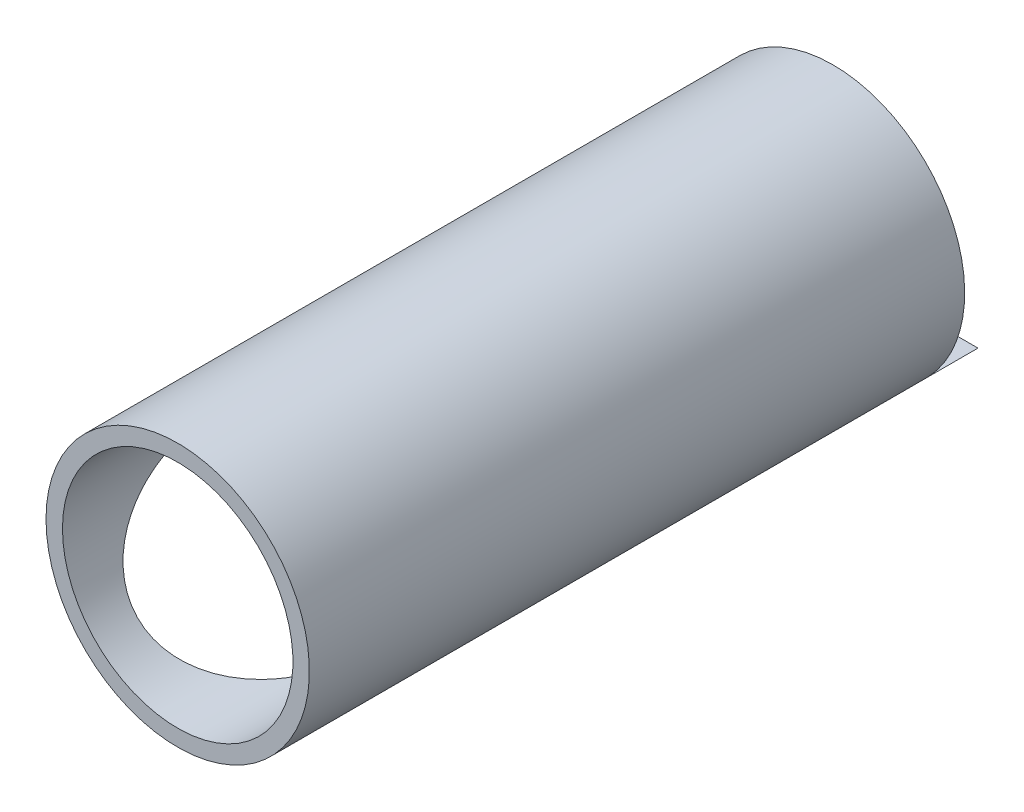
ISO-10303-21;
HEADER;
FILE_DESCRIPTION(('STEP AP214'),'2;1');
FILE_NAME('part.step','',(''),(''),'','','');
FILE_SCHEMA(('AUTOMOTIVE_DESIGN { 1 0 10303 214 1 1 1 1 }'));
ENDSEC;
DATA;
#1=APPLICATION_CONTEXT('core data for automotive mechanical design processes');
#2=APPLICATION_PROTOCOL_DEFINITION('international standard','automotive_design',2000,#1);
#3=PRODUCT_CONTEXT('',#1,'mechanical');
#4=PRODUCT('Part','Part','',(#3));
#5=PRODUCT_RELATED_PRODUCT_CATEGORY('part','',(#4));
#6=PRODUCT_DEFINITION_FORMATION('','',#4);
#7=PRODUCT_DEFINITION_CONTEXT('part definition',#1,'design');
#8=PRODUCT_DEFINITION('design','',#6,#7);
#9=PRODUCT_DEFINITION_SHAPE('','',#8);
#10=(LENGTH_UNIT() NAMED_UNIT(*) SI_UNIT(.MILLI.,.METRE.));
#11=(NAMED_UNIT(*) PLANE_ANGLE_UNIT() SI_UNIT($,.RADIAN.));
#12=(NAMED_UNIT(*) SI_UNIT($,.STERADIAN.) SOLID_ANGLE_UNIT());
#13=UNCERTAINTY_MEASURE_WITH_UNIT(LENGTH_MEASURE(1.E-05),#10,'distance_accuracy_value','');
#14=(GEOMETRIC_REPRESENTATION_CONTEXT(3) GLOBAL_UNCERTAINTY_ASSIGNED_CONTEXT((#13)) GLOBAL_UNIT_ASSIGNED_CONTEXT((#10,
#11,#12)) REPRESENTATION_CONTEXT('',''));
#15=CARTESIAN_POINT('',(0.,0.,0.));
#16=DIRECTION('',(0.,0.,1.));
#17=DIRECTION('',(1.,0.,0.));
#18=AXIS2_PLACEMENT_3D('',#15,#16,#17);
#19=CARTESIAN_POINT('',(0.,0.,914.4));
#20=DIRECTION('',(0.,0.,-1.));
#21=DIRECTION('',(-1.,0.,0.));
#22=AXIS2_PLACEMENT_3D('',#19,#20,#21);
#23=CYLINDRICAL_SURFACE('',#22,25.4);
#24=CARTESIAN_POINT('',(-25.4,0.,115.19761790129));
#25=CARTESIAN_POINT('',(-25.399996884516,-0.271241277179025,115.740107734813));
#26=CARTESIAN_POINT('',(-25.3956372703446,-0.570319205410117,116.268795318202));
#27=CARTESIAN_POINT('',(-25.3730067966504,-1.21427593289881,117.297529798691));
#28=CARTESIAN_POINT('',(-25.3547223737562,-1.55919911687239,117.797548259892));
#29=CARTESIAN_POINT('',(-25.2993697103061,-2.28826210371164,118.770410162585));
#30=CARTESIAN_POINT('',(-25.2622187567671,-2.67256859427139,119.243123644354));
#31=CARTESIAN_POINT('',(-25.1647450990912,-3.47245511366578,120.158445068275));
#32=CARTESIAN_POINT('',(-25.1044292933946,-3.88802580249541,120.601061926988));
#33=CARTESIAN_POINT('',(-24.956913941438,-4.7434234668756,121.453811569184));
#34=CARTESIAN_POINT('',(-24.8698241527874,-5.18314549994396,121.864068536087));
#35=CARTESIAN_POINT('',(-24.6649935561155,-6.08370120049547,122.652636231781));
#36=CARTESIAN_POINT('',(-24.5472493952855,-6.54453717276067,123.030943460085));
#37=CARTESIAN_POINT('',(-24.2779838816026,-7.48174520991067,123.752546174178));
#38=CARTESIAN_POINT('',(-24.1265460094466,-7.95807643493598,124.095925187073));
#39=CARTESIAN_POINT('',(-23.8717509700124,-8.68129558234989,124.583152262138));
#40=CARTESIAN_POINT('',(-23.7822196818804,-8.92380619331525,124.740911632665));
#41=CARTESIAN_POINT('',(-23.5935700495922,-9.41125713681797,125.046817140195));
#42=CARTESIAN_POINT('',(-23.4944492762025,-9.656198070834,125.194960825362));
#43=CARTESIAN_POINT('',(-23.2247367736403,-10.2933018383133,125.565823763737));
#44=CARTESIAN_POINT('',(-23.0465583327941,-10.6868211506589,125.780803863008));
#45=CARTESIAN_POINT('',(-22.6642694391263,-11.47531377387,126.183069680225));
#46=CARTESIAN_POINT('',(-22.4601643886902,-11.8702867652277,126.370361150171));
#47=CARTESIAN_POINT('',(-22.0254946586909,-12.65859700988,126.715177849977));
#48=CARTESIAN_POINT('',(-21.7949363203582,-13.0519346318665,126.872710189663));
#49=CARTESIAN_POINT('',(-21.3073191953774,-13.8336668949029,127.155982188105));
#50=CARTESIAN_POINT('',(-21.0502600567856,-14.2220614702298,127.281721424556));
#51=CARTESIAN_POINT('',(-20.5085633518285,-14.9927328173247,127.500203111253));
#52=CARTESIAN_POINT('',(-20.2237605972016,-15.3749548841771,127.592730349098));
#53=CARTESIAN_POINT('',(-19.6293574322414,-16.1269336835204,127.742092104226));
#54=CARTESIAN_POINT('',(-19.319756962012,-16.4966903858996,127.798926535294));
#55=CARTESIAN_POINT('',(-18.6780303664952,-17.2198954187818,127.875851877453));
#56=CARTESIAN_POINT('',(-18.3459128981925,-17.5733499300592,127.895956827571));
#57=CARTESIAN_POINT('',(-17.6618817726447,-18.2606942591141,127.899080882537));
#58=CARTESIAN_POINT('',(-17.3099697653684,-18.5945857028433,127.882103073958));
#59=CARTESIAN_POINT('',(-16.6270671512171,-19.2064726319405,127.815069078986));
#60=CARTESIAN_POINT('',(-16.2976885389337,-19.4866746827785,127.768623719311));
#61=CARTESIAN_POINT('',(-15.6283741294645,-20.027455985859,127.646906514994));
#62=CARTESIAN_POINT('',(-15.2884392009977,-20.2880368467907,127.571637036651));
#63=CARTESIAN_POINT('',(-14.6006748870112,-20.7884875811487,127.393303956263));
#64=CARTESIAN_POINT('',(-14.2528445044299,-21.0283548202138,127.290236825761));
#65=CARTESIAN_POINT('',(-13.5520038952238,-21.4867061050097,127.057622671844));
#66=CARTESIAN_POINT('',(-13.1989934153815,-21.7051891013881,126.928074349925));
#67=CARTESIAN_POINT('',(-12.4792330202116,-22.1270918611747,126.639509143041));
#68=CARTESIAN_POINT('',(-12.1124000184566,-22.3298222766245,126.479693973154));
#69=CARTESIAN_POINT('',(-11.3786027888657,-22.7125221018277,126.135161504374));
#70=CARTESIAN_POINT('',(-11.0116385598695,-22.8924913050908,125.950443979598));
#71=CARTESIAN_POINT('',(-10.2799960442468,-23.230239489251,125.557782389622));
#72=CARTESIAN_POINT('',(-9.91531765628702,-23.3880194605585,125.34983936183));
#73=CARTESIAN_POINT('',(-9.19038423582648,-23.6822700565084,124.91226487316));
#74=CARTESIAN_POINT('',(-8.83012978814973,-23.818737891142,124.682630578945));
#75=CARTESIAN_POINT('',(-8.05711577134304,-24.0922716625046,124.163492634032));
#76=CARTESIAN_POINT('',(-7.6455066580469,-24.2257170181536,123.870363742089));
#77=CARTESIAN_POINT('',(-6.83401281399981,-24.4670290110867,123.258484891489));
#78=CARTESIAN_POINT('',(-6.43412921537209,-24.5748931855337,122.93973246987));
#79=CARTESIAN_POINT('',(-5.64816177015132,-24.7673629961608,122.277449080718));
#80=CARTESIAN_POINT('',(-5.26210746615034,-24.8519211555429,121.933869307208));
#81=CARTESIAN_POINT('',(-4.50758946543753,-24.9997891648458,121.223615047922));
#82=CARTESIAN_POINT('',(-4.13912647413205,-25.0630981632945,120.856939637382));
#83=CARTESIAN_POINT('',(-3.35429643522984,-25.1812386856703,120.028769714766));
#84=CARTESIAN_POINT('',(-2.94227791708933,-25.2321216539066,119.562568949698));
#85=CARTESIAN_POINT('',(-2.15381144472159,-25.3116205245382,118.598868913691));
#86=CARTESIAN_POINT('',(-1.77737628913197,-25.3402284416078,118.101358487648));
#87=CARTESIAN_POINT('',(-1.06873768750256,-25.3799809030993,117.076597288797));
#88=CARTESIAN_POINT('',(-0.736439066607194,-25.3911636010426,116.54941411804));
#89=CARTESIAN_POINT('',(-0.124942535831659,-25.4015329383742,115.465105713578));
#90=CARTESIAN_POINT('',(0.154297489814211,-25.4007291327888,114.908004681836));
#91=CARTESIAN_POINT('',(0.553237396282174,-25.3944310480433,113.985383662015));
#92=CARTESIAN_POINT('',(0.693018270490364,-25.3908570940125,113.628473711015));
#93=CARTESIAN_POINT('',(0.94512273222276,-25.3827235760141,112.905071640228));
#94=CARTESIAN_POINT('',(1.05745117391027,-25.3781641865611,112.538581227171));
#95=CARTESIAN_POINT('',(1.25159327597123,-25.3693314521935,111.798324362047));
#96=CARTESIAN_POINT('',(1.33346675104875,-25.3650575602488,111.424573705684));
#97=CARTESIAN_POINT('',(1.46456329543068,-25.3578270966536,110.671326212404));
#98=CARTESIAN_POINT('',(1.51378635006301,-25.354870525595,110.291829372904));
#99=CARTESIAN_POINT('',(1.57811107207194,-25.3509493636042,109.52774408559));
#100=CARTESIAN_POINT('',(1.59301731169528,-25.3499961842703,109.14313896024));
#101=CARTESIAN_POINT('',(1.58759991189536,-25.3503359079125,108.374191206317));
#102=CARTESIAN_POINT('',(1.56727712359092,-25.3516287566256,107.989848571627));
#103=CARTESIAN_POINT('',(1.49208831517239,-25.3561643630666,107.224191861372));
#104=CARTESIAN_POINT('',(1.43718634285263,-25.3594091500799,106.842881356675));
#105=CARTESIAN_POINT('',(1.29464492745785,-25.3670839076896,106.086456834945));
#106=CARTESIAN_POINT('',(1.20700099538826,-25.371514040776,105.711343674949));
#107=CARTESIAN_POINT('',(0.980902477161915,-25.3813529134177,104.894946380384));
#108=CARTESIAN_POINT('',(0.835777035463897,-25.3867794319655,104.455510402764));
#109=CARTESIAN_POINT('',(0.507154134275928,-25.3954668343642,103.591257194624));
#110=CARTESIAN_POINT('',(0.323647648258826,-25.3987272080225,103.166443430402));
#111=CARTESIAN_POINT('',(-0.0770263208382003,-25.4006741460511,102.331998321726));
#112=CARTESIAN_POINT('',(-0.294262727729364,-25.3993512242246,101.922400241568));
#113=CARTESIAN_POINT('',(-0.757475413734714,-25.3897602752109,101.11995714986));
#114=CARTESIAN_POINT('',(-1.00345359087684,-25.3814917891344,100.727113247052));
#115=CARTESIAN_POINT('',(-1.61170048531084,-25.351232121151,99.8221920543274));
#116=CARTESIAN_POINT('',(-1.98429993857996,-25.3254177686757,99.3171662826178));
#117=CARTESIAN_POINT('',(-2.76675204273885,-25.2519240483387,98.3384692237315));
#118=CARTESIAN_POINT('',(-3.17661658762774,-25.2042376797456,97.8648080312296));
#119=CARTESIAN_POINT('',(-4.02737594321069,-25.0823658223098,96.9491184538929));
#120=CARTESIAN_POINT('',(-4.4682966327583,-25.0081580184876,96.5071170845317));
#121=CARTESIAN_POINT('',(-5.3752666028218,-24.8290194983076,95.6564636918793));
#122=CARTESIAN_POINT('',(-5.84131285206544,-24.724092481331,95.2478076605268));
#123=CARTESIAN_POINT('',(-6.79828482212831,-24.4783525146508,94.4619117354102));
#124=CARTESIAN_POINT('',(-7.28941090232365,-24.3371951614829,94.0850222322308));
#125=CARTESIAN_POINT('',(-8.28712024492864,-24.0157952057166,93.3701431254549));
#126=CARTESIAN_POINT('',(-8.79370536240002,-23.8355478964071,93.0321582137585));
#127=CARTESIAN_POINT('',(-9.81572873469016,-23.4331411642517,92.3995756753118));
#128=CARTESIAN_POINT('',(-10.3311437831871,-23.2110797202126,92.1048794317594));
#129=CARTESIAN_POINT('',(-11.1066996257145,-22.8447602783499,91.6982061388384));
#130=CARTESIAN_POINT('',(-11.3655929585738,-22.7171330118822,91.5685568233948));
#131=CARTESIAN_POINT('',(-11.8835164691699,-22.4505424962604,91.3215323699994));
#132=CARTESIAN_POINT('',(-12.1425466648598,-22.311576512855,91.2041602082601));
#133=CARTESIAN_POINT('',(-12.7690408068738,-21.9610835014072,90.9354698528196));
#134=CARTESIAN_POINT('',(-13.1360987988477,-21.74369789173,90.7907497277929));
#135=CARTESIAN_POINT('',(-13.865638389969,-21.2858987691318,90.5291666894896));
#136=CARTESIAN_POINT('',(-14.2281210429681,-21.0454906727892,90.4122972461514));
#137=CARTESIAN_POINT('',(-14.9454844243167,-20.5422568523566,90.2079532074419));
#138=CARTESIAN_POINT('',(-15.3003690930736,-20.2794431186361,90.1204630120581));
#139=CARTESIAN_POINT('',(-15.9997195610791,-19.7323607677398,89.9760625884963));
#140=CARTESIAN_POINT('',(-16.3441850151508,-19.4480914408521,89.9191533723873));
#141=CARTESIAN_POINT('',(-17.0207584763859,-18.8588341417784,89.8366780026542));
#142=CARTESIAN_POINT('',(-17.3528252139914,-18.5537851303095,89.8112087961173));
#143=CARTESIAN_POINT('',(-18.0006837612706,-17.9259270825917,89.7923503154354));
#144=CARTESIAN_POINT('',(-18.3164756256078,-17.603118106002,89.7989609335346));
#145=CARTESIAN_POINT('',(-18.9293810106725,-16.9423036379575,89.8441550106406));
#146=CARTESIAN_POINT('',(-19.2264923115179,-16.6042963485846,89.8827422618547));
#147=CARTESIAN_POINT('',(-19.8000271719328,-15.916016949537,89.9912740926826));
#148=CARTESIAN_POINT('',(-20.0764510291509,-15.5657450164311,90.0612182210357));
#149=CARTESIAN_POINT('',(-20.5954930135348,-14.8716225458881,90.2276397076533));
#150=CARTESIAN_POINT('',(-20.8390639643237,-14.5281689561037,90.3228123679476));
#151=CARTESIAN_POINT('',(-21.3052488484002,-13.8354855605997,90.5396020864954));
#152=CARTESIAN_POINT('',(-21.5278635577863,-13.4862559693536,90.6612181648845));
#153=CARTESIAN_POINT('',(-21.9518553848062,-12.7845270544829,90.9294990521152));
#154=CARTESIAN_POINT('',(-22.1532303303779,-12.4320274004513,91.076166418791));
#155=CARTESIAN_POINT('',(-22.5348141579971,-11.7261736875684,91.3930454102795));
#156=CARTESIAN_POINT('',(-22.7150217974459,-11.372819579799,91.5632584160319));
#157=CARTESIAN_POINT('',(-23.0714463322967,-10.6326530526909,91.9436200743579));
#158=CARTESIAN_POINT('',(-23.2455144992037,-10.2459799359405,92.1560521031993));
#159=CARTESIAN_POINT('',(-23.5695077220637,-9.47694313410714,92.6056281398078));
#160=CARTESIAN_POINT('',(-23.7194314522228,-9.09457968674373,92.8427735034307));
#161=CARTESIAN_POINT('',(-23.9964086596038,-8.33638708197403,93.3401913025506));
#162=CARTESIAN_POINT('',(-24.1234497223651,-7.96056157085758,93.6004761781752));
#163=CARTESIAN_POINT('',(-24.3559794084299,-7.21787547520695,94.1425983819164));
#164=CARTESIAN_POINT('',(-24.461465358881,-6.8510160074294,94.4244383769387));
#165=CARTESIAN_POINT('',(-24.6709611029004,-6.05827955124724,95.0651322846048));
#166=CARTESIAN_POINT('',(-24.7707104204364,-5.63476821168867,95.4283164901055));
#167=CARTESIAN_POINT('',(-24.9445208739744,-4.80725158145645,96.182107079803));
#168=CARTESIAN_POINT('',(-25.0185774543647,-4.40324976096083,96.5727183123724));
#169=CARTESIAN_POINT('',(-25.1440826941316,-3.6184412625543,97.380584949219));
#170=CARTESIAN_POINT('',(-25.195514376116,-3.23765218708388,97.7978600937306));
#171=CARTESIAN_POINT('',(-25.278952714014,-2.50413952181317,98.6581695882332));
#172=CARTESIAN_POINT('',(-25.3109628239372,-2.15141095132179,99.1011993425551));
#173=CARTESIAN_POINT('',(-25.3552592552367,-1.53326456581029,99.9397030646464));
#174=CARTESIAN_POINT('',(-25.3698843942796,-1.26291357187829,100.331419795856));
#175=CARTESIAN_POINT('',(-25.3902341038063,-0.74963955445348,101.132752111651));
#176=CARTESIAN_POINT('',(-25.3959585303675,-0.506716974530866,101.542367985551));
#177=CARTESIAN_POINT('',(-25.4009542221154,-0.0533320587262626,102.378298401485));
#178=CARTESIAN_POINT('',(-25.4002377705422,0.157191285018287,102.804579615551));
#179=CARTESIAN_POINT('',(-25.3949634431588,0.541044797500732,103.673572884746));
#180=CARTESIAN_POINT('',(-25.3904067101235,0.714386011492275,104.116280014458));
#181=CARTESIAN_POINT('',(-25.3811661701529,0.985166496287806,104.918089477687));
#182=CARTESIAN_POINT('',(-25.376726345751,1.09091447781919,105.274392609978));
#183=CARTESIAN_POINT('',(-25.368212492492,1.2736536232883,105.994324979245));
#184=CARTESIAN_POINT('',(-25.3641384173945,1.35064842629128,106.357953282989));
#185=CARTESIAN_POINT('',(-25.3572911025174,1.47363686584826,107.090140802023));
#186=CARTESIAN_POINT('',(-25.3545167380819,1.51965732001224,107.458695469333));
#187=CARTESIAN_POINT('',(-25.3508693576583,1.57934590585103,108.198441987783));
#188=CARTESIAN_POINT('',(-25.3499963076149,1.59301461699214,108.569633791569));
#189=CARTESIAN_POINT('',(-25.3503398347899,1.58753801487445,109.312451992033));
#190=CARTESIAN_POINT('',(-25.3515602400846,1.5683325883543,109.684077940431));
#191=CARTESIAN_POINT('',(-25.3558343595999,1.49763104334657,110.424241421527));
#192=CARTESIAN_POINT('',(-25.3588882384586,1.44613202501265,110.79277867386));
#193=CARTESIAN_POINT('',(-25.3661576130333,1.31244067638447,111.524282879397));
#194=CARTESIAN_POINT('',(-25.3703734064144,1.23024047898866,111.887248380013));
#195=CARTESIAN_POINT('',(-25.3789861546464,1.03746853485511,112.605429577939));
#196=CARTESIAN_POINT('',(-25.3833830713276,0.926902740442614,112.960646884206));
#197=CARTESIAN_POINT('',(-25.3908831358234,0.689882204213892,113.634010363112));
#198=CARTESIAN_POINT('',(-25.3940614846724,0.565397111641226,113.952854163036));
#199=CARTESIAN_POINT('',(-25.3986199350271,0.296875659780158,114.581793700224));
#200=CARTESIAN_POINT('',(-25.4000017557323,0.152858138176353,114.891897522761));
#201=CARTESIAN_POINT('',(-25.4,0.,115.19761790129));
#202=B_SPLINE_CURVE_WITH_KNOTS('',3,(#24,#25,#26,#27,#28,#29,#30,#31,#32,#33,#34,#35,#36,#37,
#38,#39,#40,#41,#42,#43,#44,#45,#46,#47,#48,#49,#50,#51,#52,#53,#54,#55,#56,#57,#58,#59,#60,#61,
#62,#63,#64,#65,#66,#67,#68,#69,#70,#71,#72,#73,#74,#75,#76,#77,#78,#79,#80,#81,#82,#83,#84,#85,
#86,#87,#88,#89,#90,#91,#92,#93,#94,#95,#96,#97,#98,#99,#100,#101,#102,#103,#104,#105,#106,#107,
#108,#109,#110,#111,#112,#113,#114,#115,#116,#117,#118,#119,#120,#121,#122,#123,#124,#125,#126,
#127,#128,#129,#130,#131,#132,#133,#134,#135,#136,#137,#138,#139,#140,#141,#142,#143,#144,#145,
#146,#147,#148,#149,#150,#151,#152,#153,#154,#155,#156,#157,#158,#159,#160,#161,#162,#163,#164,
#165,#166,#167,#168,#169,#170,#171,#172,#173,#174,#175,#176,#177,#178,#179,#180,#181,#182,#183,
#184,#185,#186,#187,#188,#189,#190,#191,#192,#193,#194,#195,#196,#197,#198,#199,#200,#201),
.UNSPECIFIED.,.T.,.F.,(4,2,2,2,2,2,2,2,2,2,2,2,2,2,2,2,2,2,2,2,2,2,2,2,2,2,2,2,2,2,2,2,2,2,2,2,
2,2,2,2,2,2,2,2,2,2,2,2,2,2,2,2,2,2,2,2,2,2,2,2,2,2,2,2,2,2,2,2,2,2,2,2,2,2,2,2,2,2,2,2,2,2,2,2,
2,2,2,2,4),(0.,1.81915294750143,3.64008009927944,5.46906021978367,7.29749609597438,
9.11853421291276,10.9397715888551,12.7565458826534,13.6648141538222,14.5733131153619,
16.0193627630085,17.4651115868309,18.9105145652742,20.3559367418562,21.8105629474513,
23.2651926666379,24.7192662695313,26.1732188475864,27.476475010019,28.779624205347,
30.0829388920246,31.3863175020035,32.7306650687759,34.0750248306291,35.4193245682931,
36.763800143326,38.3302330971527,39.8968167986839,41.4665685974207,43.0363832899539,
44.9069822833641,46.7782515546435,48.6454177877854,50.511095691322,51.660122237725,
52.8089454650065,53.9555002950702,55.1020556403594,56.2551244190884,57.4081653405386,
58.5624070696992,59.7168071060463,61.1031538884354,62.4898270818615,63.8793720313502,
65.2690087945045,67.1508436721502,69.0332813028126,70.9173065487157,72.801105002906,
74.7035205580765,76.6061653050283,78.5044060401529,79.4533015219213,80.4024265032348,
81.7523909105197,83.1020384837889,84.4509682737002,85.7999427033179,87.1530664661165,
88.5061856837883,89.8594653950051,91.2127256316372,92.5063669143788,93.7999602692305,
95.0936857840444,96.3874872073888,97.8089644320044,99.2305196846883,100.652843861365,
102.075344300573,103.773945062008,105.472846850756,107.173021304911,108.872893304571,
110.300342464471,111.727814705662,113.152565228016,114.576891928727,115.690899923509,
116.804766879178,117.917668203318,119.030549593643,120.145468160406,121.260486857116,
122.375791470868,123.490862236784,124.517029383072,125.542213807453),.UNSPECIFIED.);
#203=CARTESIAN_POINT('',(-25.4,0.,115.19761790129));
#204=VERTEX_POINT('',#203);
#205=EDGE_CURVE('E113',#204,#204,#202,.T.);
#206=ORIENTED_EDGE('',*,*,#205,.T.);
#207=EDGE_LOOP('',(#206));
#208=FACE_BOUND('',#207,.T.);
#209=DIRECTION('',(0.,0.,1.));
#210=VECTOR('',#209,1.);
#211=CARTESIAN_POINT('',(18.4450831863128,-17.4625,0.));
#212=LINE('',#211,#210);
#213=CARTESIAN_POINT('',(18.4450831863128,-17.4625,0.));
#214=VERTEX_POINT('',#213);
#215=CARTESIAN_POINT('',(18.4450831863128,-17.4625,9.525));
#216=VERTEX_POINT('',#215);
#217=EDGE_CURVE('E73',#214,#216,#212,.T.);
#218=ORIENTED_EDGE('',*,*,#217,.T.);
#219=CARTESIAN_POINT('',(0.,0.,9.525));
#220=DIRECTION('',(0.,0.,-1.));
#221=DIRECTION('',(-1.,0.,0.));
#222=AXIS2_PLACEMENT_3D('',#219,#220,#221);
#223=CIRCLE('',#222,25.4);
#224=CARTESIAN_POINT('',(-18.4450831863128,-17.4625,9.525));
#225=VERTEX_POINT('',#224);
#226=EDGE_CURVE('E105',#225,#216,#223,.T.);
#227=ORIENTED_EDGE('',*,*,#226,.F.);
#228=DIRECTION('',(0.,0.,1.));
#229=VECTOR('',#228,1.);
#230=CARTESIAN_POINT('',(-18.4450831863128,-17.4625,0.));
#231=LINE('',#230,#229);
#232=CARTESIAN_POINT('',(-18.4450831863128,-17.4625,0.));
#233=VERTEX_POINT('',#232);
#234=EDGE_CURVE('E81',#233,#225,#231,.T.);
#235=ORIENTED_EDGE('',*,*,#234,.F.);
#236=CARTESIAN_POINT('',(0.,0.,0.));
#237=DIRECTION('',(0.,0.,1.));
#238=DIRECTION('',(1.,0.,0.));
#239=AXIS2_PLACEMENT_3D('',#236,#237,#238);
#240=CIRCLE('',#239,25.4);
#241=EDGE_CURVE('E87',#233,#214,#240,.T.);
#242=ORIENTED_EDGE('',*,*,#241,.T.);
#243=EDGE_LOOP('',(#218,#227,#235,#242));
#244=FACE_BOUND('',#243,.T.);
#245=CARTESIAN_POINT('',(0.,0.,135.913108616137));
#246=DIRECTION('',(0.,0.,-1.));
#247=DIRECTION('',(-1.,0.,0.));
#248=AXIS2_PLACEMENT_3D('',#245,#246,#247);
#249=CIRCLE('',#248,25.4);
#250=CARTESIAN_POINT('',(-25.4,0.,135.913108616137));
#251=VERTEX_POINT('',#250);
#252=EDGE_CURVE('E107',#251,#251,#249,.T.);
#253=ORIENTED_EDGE('',*,*,#252,.T.);
#254=EDGE_LOOP('',(#253));
#255=FACE_BOUND('',#254,.T.);
#256=ADVANCED_FACE('F32',(#208,#244,#255),#23,.T.);
#257=CARTESIAN_POINT('',(0.,0.,0.));
#258=DIRECTION('',(0.,0.,1.));
#259=DIRECTION('',(1.,0.,0.));
#260=AXIS2_PLACEMENT_3D('',#257,#258,#259);
#261=PLANE('',#260);
#262=DIRECTION('',(-1.,0.,0.));
#263=VECTOR('',#262,1.);
#264=CARTESIAN_POINT('',(18.4450831863128,-17.4625,0.));
#265=LINE('',#264,#263);
#266=CARTESIAN_POINT('',(13.748153285078,-17.4625,0.));
#267=VERTEX_POINT('',#266);
#268=EDGE_CURVE('E76',#214,#267,#265,.T.);
#269=ORIENTED_EDGE('',*,*,#268,.F.);
#270=ORIENTED_EDGE('',*,*,#241,.F.);
#271=CARTESIAN_POINT('',(-13.748153285078,-17.4625,0.));
#272=VERTEX_POINT('',#271);
#273=EDGE_CURVE('E89',#272,#233,#265,.T.);
#274=ORIENTED_EDGE('',*,*,#273,.F.);
#275=CARTESIAN_POINT('',(0.,0.,0.));
#276=DIRECTION('',(0.,0.,1.));
#277=DIRECTION('',(1.,0.,0.));
#278=AXIS2_PLACEMENT_3D('',#275,#276,#277);
#279=CIRCLE('',#278,22.225);
#280=EDGE_CURVE('E80',#272,#267,#279,.T.);
#281=ORIENTED_EDGE('',*,*,#280,.T.);
#282=EDGE_LOOP('',(#269,#270,#274,#281));
#283=FACE_BOUND('',#282,.T.);
#284=ADVANCED_FACE('F86',(#283),#261,.F.);
#285=CARTESIAN_POINT('',(0.,0.,914.4));
#286=DIRECTION('',(0.,0.,-1.));
#287=DIRECTION('',(-1.,0.,0.));
#288=AXIS2_PLACEMENT_3D('',#285,#286,#287);
#289=CYLINDRICAL_SURFACE('',#288,22.225);
#290=CARTESIAN_POINT('',(5.37569070377522,-21.5650776594323,108.84761790129));
#291=CARTESIAN_POINT('',(5.37568569150707,-21.5650801661027,109.167654188719));
#292=CARTESIAN_POINT('',(5.36043264402647,-21.5688986835287,109.48772057337));
#293=CARTESIAN_POINT('',(5.30013264309174,-21.583793558299,110.124976349021));
#294=CARTESIAN_POINT('',(5.2550700873822,-21.5948737163477,110.442164145196));
#295=CARTESIAN_POINT('',(5.13701532004456,-21.6232597551306,111.071738523344));
#296=CARTESIAN_POINT('',(5.0639561011247,-21.6405805662695,111.3841117016));
#297=CARTESIAN_POINT('',(4.89267787070105,-21.6799450538418,112.00165421313));
#298=CARTESIAN_POINT('',(4.7944482813513,-21.7019907152544,112.30682045866));
#299=CARTESIAN_POINT('',(4.6076721340386,-21.7422689326046,112.821314822801));
#300=CARTESIAN_POINT('',(4.52460603417373,-21.7597480432154,113.03272439853));
#301=CARTESIAN_POINT('',(4.3484326153226,-21.7956383644799,113.451147419991));
#302=CARTESIAN_POINT('',(4.25532827085673,-21.8140492981637,113.658162146355));
#303=CARTESIAN_POINT('',(3.96229024602982,-21.8698496417926,114.27286665832));
#304=CARTESIAN_POINT('',(3.74869750255787,-21.9077917762655,114.674039605608));
#305=CARTESIAN_POINT('',(3.29125753233346,-21.9811764718758,115.460343620592));
#306=CARTESIAN_POINT('',(3.04732210414693,-22.0166112529991,115.845423359157));
#307=CARTESIAN_POINT('',(2.53482996508755,-22.0814848319543,116.599269100631));
#308=CARTESIAN_POINT('',(2.26627490860059,-22.1109240322486,116.968036197249));
#309=CARTESIAN_POINT('',(1.77518233470005,-22.1550174331362,117.603719969266));
#310=CARTESIAN_POINT('',(1.55700337525721,-22.1715237946836,117.873899528831));
#311=CARTESIAN_POINT('',(1.1099725652997,-22.1983955126935,118.405610343933));
#312=CARTESIAN_POINT('',(0.881119765996517,-22.208760322112,118.667140827115));
#313=CARTESIAN_POINT('',(0.180105585228268,-22.2291816017709,119.439248375041));
#314=CARTESIAN_POINT('',(-0.306420753987105,-22.2285560132625,119.93722546287));
#315=CARTESIAN_POINT('',(-1.30985173112272,-22.1920491471913,120.898981639541));
#316=CARTESIAN_POINT('',(-1.82672458377904,-22.156204160575,121.362795402305));
#317=CARTESIAN_POINT('',(-2.88558814692918,-22.0433049867404,122.255223039663));
#318=CARTESIAN_POINT('',(-3.42756827754194,-21.9662680155849,122.683851533562));
#319=CARTESIAN_POINT('',(-4.40842040574608,-21.7877641476453,123.411665803507));
#320=CARTESIAN_POINT('',(-4.84337841158944,-21.6955569841763,123.718422068969));
#321=CARTESIAN_POINT('',(-5.72265938525436,-21.4803778091547,124.306787504442));
#322=CARTESIAN_POINT('',(-6.16698204892741,-21.3574067953549,124.588397489612));
#323=CARTESIAN_POINT('',(-7.06146262284418,-21.0785538071222,125.123560621189));
#324=CARTESIAN_POINT('',(-7.51161189219367,-20.9227162669394,125.37715095071));
#325=CARTESIAN_POINT('',(-8.18878933484326,-20.6628374355746,125.734433660658));
#326=CARTESIAN_POINT('',(-8.41483234953294,-20.5718612494727,125.849673601475));
#327=CARTESIAN_POINT('',(-8.86719163095021,-20.3809670672778,126.072109076913));
#328=CARTESIAN_POINT('',(-9.09350795338118,-20.2810467559842,126.179302515405));
#329=CARTESIAN_POINT('',(-9.69005170756554,-20.0054962964963,126.450834543853));
#330=CARTESIAN_POINT('',(-10.0600503446986,-19.8222078507291,126.608041416343));
#331=CARTESIAN_POINT('',(-10.7965361781496,-19.4308850034773,126.897727437377));
#332=CARTESIAN_POINT('',(-11.1630240572689,-19.2228555239347,127.030211490812));
#333=CARTESIAN_POINT('',(-11.8896184484902,-18.7821201186964,127.26862887505));
#334=CARTESIAN_POINT('',(-12.2497271670225,-18.5494229275814,127.374571559482));
#335=CARTESIAN_POINT('',(-12.9606327485673,-18.0598689656875,127.558308836764));
#336=CARTESIAN_POINT('',(-13.3114295071079,-17.8030119240033,127.636103113937));
#337=CARTESIAN_POINT('',(-14.0022288966007,-17.2650158050783,127.762512940711));
#338=CARTESIAN_POINT('',(-14.3421710323333,-16.9837651675695,127.810985371142));
#339=CARTESIAN_POINT('',(-15.0063370691817,-16.3998771174685,127.877260921008));
#340=CARTESIAN_POINT('',(-15.3305609363222,-16.0972396586518,127.895063974153));
#341=CARTESIAN_POINT('',(-15.9603772982939,-15.4729944931296,127.899659973232));
#342=CARTESIAN_POINT('',(-16.2659713855833,-15.1513884124831,127.886455573483));
#343=CARTESIAN_POINT('',(-16.8560901427895,-14.4920179388809,127.829294153571));
#344=CARTESIAN_POINT('',(-17.1406157434959,-14.1542542608419,127.785338492872));
#345=CARTESIAN_POINT('',(-17.6655925729985,-13.4922916826017,127.672057791362));
#346=CARTESIAN_POINT('',(-17.9077506209801,-13.1690599661776,127.604954374434));
#347=CARTESIAN_POINT('',(-18.3714812653711,-12.5140051495239,127.446279940906));
#348=CARTESIAN_POINT('',(-18.5930551612016,-12.1821825933036,127.354710470198));
#349=CARTESIAN_POINT('',(-19.015057940818,-11.5123806843439,127.148358271414));
#350=CARTESIAN_POINT('',(-19.2154857343115,-11.1744010151964,127.033574347291));
#351=CARTESIAN_POINT('',(-19.5950308417635,-10.4946161083882,126.782216521123));
#352=CARTESIAN_POINT('',(-19.7741468292411,-10.1528106340504,126.645641263989));
#353=CARTESIAN_POINT('',(-20.1240919097865,-9.44142042231195,126.341017276752));
#354=CARTESIAN_POINT('',(-20.2932509618332,-9.07170259008042,126.171363717685));
#355=CARTESIAN_POINT('',(-20.6077035164476,-8.33273428008442,125.810412157463));
#356=CARTESIAN_POINT('',(-20.7529964572834,-7.96348381352316,125.619113647034));
#357=CARTESIAN_POINT('',(-21.0206856284734,-7.22736820751031,125.216529107163));
#358=CARTESIAN_POINT('',(-21.1430707315423,-6.86050431039465,125.005233438911));
#359=CARTESIAN_POINT('',(-21.365981597503,-6.13114570462089,124.564309890824));
#360=CARTESIAN_POINT('',(-21.4665029170593,-5.76865189820066,124.334678297551));
#361=CARTESIAN_POINT('',(-21.6922874936429,-4.86882787478091,123.738709368111));
#362=CARTESIAN_POINT('',(-21.8045696324362,-4.335253020581,123.361699896341));
#363=CARTESIAN_POINT('',(-21.9871034703119,-3.28654906379047,122.573228105144));
#364=CARTESIAN_POINT('',(-22.0573356675643,-2.77142862390608,122.161749900568));
#365=CARTESIAN_POINT('',(-22.1607422107368,-1.76333594092988,121.306093917064));
#366=CARTESIAN_POINT('',(-22.1938362445548,-1.27041390180071,120.861847476948));
#367=CARTESIAN_POINT('',(-22.2279526231295,-0.312991944076161,119.942833798038));
#368=CARTESIAN_POINT('',(-22.2289847609605,0.151516609947704,119.468075923139));
#369=CARTESIAN_POINT('',(-22.2073850057381,0.953087377167786,118.589732935536));
#370=CARTESIAN_POINT('',(-22.1896274012143,1.29657091386188,118.191866556911));
#371=CARTESIAN_POINT('',(-22.1410646889642,1.95800107650606,117.376010942945));
#372=CARTESIAN_POINT('',(-22.1102574838516,2.27594358761946,116.958018482432));
#373=CARTESIAN_POINT('',(-22.0396910119963,2.88007703802485,116.101809938348));
#374=CARTESIAN_POINT('',(-21.9999544619767,3.16634584604737,115.663647379289));
#375=CARTESIAN_POINT('',(-21.9164399942866,3.70044365177787,114.765170539474));
#376=CARTESIAN_POINT('',(-21.8726647789907,3.948298060197,114.304871168346));
#377=CARTESIAN_POINT('',(-21.7786461266314,4.44024185062503,113.266904452055));
#378=CARTESIAN_POINT('',(-21.7288360125788,4.67388888050859,112.684031093445));
#379=CARTESIAN_POINT('',(-21.6656729760855,4.95566049467112,111.78812202674));
#380=CARTESIAN_POINT('',(-21.6465551112713,5.03809441218875,111.486146233694));
#381=CARTESIAN_POINT('',(-21.6136347871933,5.17750493200839,110.8759924439));
#382=CARTESIAN_POINT('',(-21.5998321400148,5.23448243431101,110.567814666823));
#383=CARTESIAN_POINT('',(-21.5786518766343,5.32113308847625,109.944029727334));
#384=CARTESIAN_POINT('',(-21.5713442587147,5.35050896028109,109.628378395467));
#385=CARTESIAN_POINT('',(-21.5641203192427,5.37955141432031,108.995625836371));
#386=CARTESIAN_POINT('',(-21.5642035433113,5.37921982292921,108.678524699471));
#387=CARTESIAN_POINT('',(-21.5717551854945,5.34885384065991,108.045625483277));
#388=CARTESIAN_POINT('',(-21.579228926258,5.31879804241115,107.729828507845));
#389=CARTESIAN_POINT('',(-21.6008387577061,5.23033722579932,107.102476089776));
#390=CARTESIAN_POINT('',(-21.6149759460751,5.17192753659021,106.790921354677));
#391=CARTESIAN_POINT('',(-21.6516822822977,5.01624973129902,106.118563098149));
#392=CARTESIAN_POINT('',(-21.675311979681,4.91387508104649,105.759005047519));
#393=CARTESIAN_POINT('',(-21.7275096858906,4.67766136710961,105.050811077777));
#394=CARTESIAN_POINT('',(-21.7560790574951,4.54381361681543,104.702178204184));
#395=CARTESIAN_POINT('',(-21.8155849129217,4.24894470005709,104.015661508343));
#396=CARTESIAN_POINT('',(-21.8465282677726,4.0878428958773,103.67781322785));
#397=CARTESIAN_POINT('',(-21.9082613291092,3.74292254193654,103.014002384563));
#398=CARTESIAN_POINT('',(-21.939051027829,3.55910285583752,102.688040417375));
#399=CARTESIAN_POINT('',(-22.018294190083,3.0417594168688,101.831582329051));
#400=CARTESIAN_POINT('',(-22.0646608982133,2.69086102779616,101.311357244868));
#401=CARTESIAN_POINT('',(-22.1427066552353,1.94715088350466,100.300519064911));
#402=CARTESIAN_POINT('',(-22.1743762535858,1.55431235904081,99.8099251984617));
#403=CARTESIAN_POINT('',(-22.216661149136,0.734420643294176,98.856135170071));
#404=CARTESIAN_POINT('',(-22.2272477858802,0.307321696786049,98.3929771329595));
#405=CARTESIAN_POINT('',(-22.2219486578178,-0.574595924328619,97.4942584246298));
#406=CARTESIAN_POINT('',(-22.2060689732108,-1.02940820912876,97.0586914386846));
#407=CARTESIAN_POINT('',(-22.1415404726734,-1.98598573632069,96.1940659061397));
#408=CARTESIAN_POINT('',(-22.091267475084,-2.48896249376192,95.7664628275615));
#409=CARTESIAN_POINT('',(-21.9512518932454,-3.51595114288243,94.943957335144));
#410=CARTESIAN_POINT('',(-21.8615017671982,-4.03996703653372,94.549061186847));
#411=CARTESIAN_POINT('',(-21.6379954583547,-5.10313111202669,93.7960651706918));
#412=CARTESIAN_POINT('',(-21.5043468427874,-5.64223938735165,93.4378781392218));
#413=CARTESIAN_POINT('',(-21.2676856193289,-6.45883360562285,92.9309093329038));
#414=CARTESIAN_POINT('',(-21.182781969761,-6.7323137530653,92.7669930787033));
#415=CARTESIAN_POINT('',(-21.0003859634101,-7.28135254519091,92.4497946571411));
#416=CARTESIAN_POINT('',(-20.9028906776772,-7.55691165937766,92.2965149767537));
#417=CARTESIAN_POINT('',(-20.6539530555409,-8.21790011603664,91.9432587222274));
#418=CARTESIAN_POINT('',(-20.4963751167483,-8.60391318048833,91.7486286653472));
#419=CARTESIAN_POINT('',(-20.1550270927097,-9.37568632622446,91.3835534364473));
#420=CARTESIAN_POINT('',(-19.9712639521738,-9.76144644742824,91.2131018757684));
#421=CARTESIAN_POINT('',(-19.5770026934344,-10.5298597056035,90.8985037525499));
#422=CARTESIAN_POINT('',(-19.3665158269999,-10.9125140784937,90.7543461810638));
#423=CARTESIAN_POINT('',(-18.9186547144862,-11.6717330112078,90.4943465566393));
#424=CARTESIAN_POINT('',(-18.6812798140584,-12.0482974225709,90.3785051930225));
#425=CARTESIAN_POINT('',(-18.1784093715375,-12.7945249305157,90.1763554731886));
#426=CARTESIAN_POINT('',(-17.9127281790855,-13.1641210514414,90.0902600737123));
#427=CARTESIAN_POINT('',(-17.3558858754443,-13.890035055766,89.950343340326));
#428=CARTESIAN_POINT('',(-17.064724788609,-14.2463529518559,89.8965219755686));
#429=CARTESIAN_POINT('',(-16.4590364522957,-14.9419997330558,89.8222458965447));
#430=CARTESIAN_POINT('',(-16.144517944797,-15.2813348954884,89.8017787639427));
#431=CARTESIAN_POINT('',(-15.4947067010362,-15.9398432344132,89.7946037939111));
#432=CARTESIAN_POINT('',(-15.1594157529661,-16.2590181416337,89.8078930544969));
#433=CARTESIAN_POINT('',(-14.5079591373846,-16.8416126824955,89.8647339972237));
#434=CARTESIAN_POINT('',(-14.1935607908668,-17.1073498081707,89.9049112359478));
#435=CARTESIAN_POINT('',(-13.5532684968447,-17.61895095196,90.0113159906125));
#436=CARTESIAN_POINT('',(-13.2273755320084,-17.8648166629828,90.0775412846109));
#437=CARTESIAN_POINT('',(-12.5666365928577,-18.3356175684558,90.2350355770049));
#438=CARTESIAN_POINT('',(-12.2317898058862,-18.5605508547027,90.3263068556078));
#439=CARTESIAN_POINT('',(-11.5556993952639,-18.9888546999573,90.532604087638));
#440=CARTESIAN_POINT('',(-11.2144554295969,-19.1922241021915,90.6476313144552));
#441=CARTESIAN_POINT('',(-10.5175463999119,-19.5830610732238,90.903816714194));
#442=CARTESIAN_POINT('',(-10.1617584698194,-19.7698565160577,91.045663481623));
#443=CARTESIAN_POINT('',(-9.44839818931803,-20.1205465378561,91.3513315279195));
#444=CARTESIAN_POINT('',(-9.09082585532268,-20.2844413270683,91.515152605017));
#445=CARTESIAN_POINT('',(-8.37601368424643,-20.5899029062449,91.8631141860682));
#446=CARTESIAN_POINT('',(-8.01877388566814,-20.7314673692794,92.0472568042327));
#447=CARTESIAN_POINT('',(-7.30653578111159,-20.9930743735012,92.4342728979741));
#448=CARTESIAN_POINT('',(-6.95153794994271,-21.113112494121,92.6371502079069));
#449=CARTESIAN_POINT('',(-6.07664582551551,-21.3851238781622,93.1613351007829));
#450=CARTESIAN_POINT('',(-5.55905932465504,-21.5249272919447,93.4928907864365));
#451=CARTESIAN_POINT('',(-4.53718478284549,-21.7632738150695,94.1897310768603));
#452=CARTESIAN_POINT('',(-4.0329023254614,-21.8617998509659,94.5550295624739));
#453=CARTESIAN_POINT('',(-3.04030728670726,-22.0218213300578,95.3174313369223));
#454=CARTESIAN_POINT('',(-2.55205112978812,-22.0831969585168,95.7146329013749));
#455=CARTESIAN_POINT('',(-1.59732663713147,-22.1727084573627,96.5376624272995));
#456=CARTESIAN_POINT('',(-1.13085466277874,-22.2008498980711,96.9634855789106));
#457=CARTESIAN_POINT('',(-0.214880588384349,-22.2287750569595,97.8516421229121));
#458=CARTESIAN_POINT('',(0.234097429665142,-22.2279819409625,98.3145343478874));
#459=CARTESIAN_POINT('',(1.09949233876783,-22.2020083620396,99.269575934566));
#460=CARTESIAN_POINT('',(1.51589417258137,-22.1768166928482,99.7617386427171));
#461=CARTESIAN_POINT('',(2.30710523056643,-22.1084763418027,100.775230882165));
#462=CARTESIAN_POINT('',(2.68203537346447,-22.065381706074,101.296468575117));
#463=CARTESIAN_POINT('',(3.2054552766698,-21.9933366043261,102.102535198194));
#464=CARTESIAN_POINT('',(3.3733676498569,-21.9681003877585,102.375134361308));
#465=CARTESIAN_POINT('',(3.69437197238745,-21.9164020777687,102.928793473239));
#466=CARTESIAN_POINT('',(3.84746185814038,-21.889939814412,103.209854593013));
#467=CARTESIAN_POINT('',(4.29015121481857,-21.8090954348946,104.083937421942));
#468=CARTESIAN_POINT('',(4.55234938921273,-21.7548647114485,104.691701707152));
#469=CARTESIAN_POINT('',(4.87231378748498,-21.6846317358838,105.627780930639));
#470=CARTESIAN_POINT('',(4.96665971351456,-21.6630969136233,105.943388505525));
#471=CARTESIAN_POINT('',(5.12790522968932,-21.6254957953189,106.581814437692));
#472=CARTESIAN_POINT('',(5.19482170963393,-21.6094261351193,106.904628228184));
#473=CARTESIAN_POINT('',(5.28916261964849,-21.5865072934061,107.497190292182));
#474=CARTESIAN_POINT('',(5.32150656296482,-21.5785237602831,107.766116040357));
#475=CARTESIAN_POINT('',(5.36477604249548,-21.5678070695503,108.3058929258));
#476=CARTESIAN_POINT('',(5.3756949460737,-21.565075537829,108.57674463326));
#477=CARTESIAN_POINT('',(5.37569070377522,-21.5650776594323,108.84761790129));
#478=B_SPLINE_CURVE_WITH_KNOTS('',3,(#290,#291,#292,#293,#294,#295,#296,#297,#298,#299,#300,
#301,#302,#303,#304,#305,#306,#307,#308,#309,#310,#311,#312,#313,#314,#315,#316,#317,#318,#319,
#320,#321,#322,#323,#324,#325,#326,#327,#328,#329,#330,#331,#332,#333,#334,#335,#336,#337,#338,
#339,#340,#341,#342,#343,#344,#345,#346,#347,#348,#349,#350,#351,#352,#353,#354,#355,#356,#357,
#358,#359,#360,#361,#362,#363,#364,#365,#366,#367,#368,#369,#370,#371,#372,#373,#374,#375,#376,
#377,#378,#379,#380,#381,#382,#383,#384,#385,#386,#387,#388,#389,#390,#391,#392,#393,#394,#395,
#396,#397,#398,#399,#400,#401,#402,#403,#404,#405,#406,#407,#408,#409,#410,#411,#412,#413,#414,
#415,#416,#417,#418,#419,#420,#421,#422,#423,#424,#425,#426,#427,#428,#429,#430,#431,#432,#433,
#434,#435,#436,#437,#438,#439,#440,#441,#442,#443,#444,#445,#446,#447,#448,#449,#450,#451,#452,
#453,#454,#455,#456,#457,#458,#459,#460,#461,#462,#463,#464,#465,#466,#467,#468,#469,#470,#471,
#472,#473,#474,#475,#476,#477),.UNSPECIFIED.,.T.,.F.,(4,2,2,2,2,2,2,2,2,2,2,2,2,2,2,2,2,2,2,2,2,
2,2,2,2,2,2,2,2,2,2,2,2,2,2,2,2,2,2,2,2,2,2,2,2,2,2,2,2,2,2,2,2,2,2,2,2,2,2,2,2,2,2,2,2,2,2,2,2,
2,2,2,2,2,2,2,2,2,2,2,2,2,2,2,2,2,2,2,2,2,2,2,2,4),(0.,0.959787701074662,1.92007815159379,
2.88268146573828,3.84568997920633,4.528868140775,5.21184441732144,6.57836366310338,
7.94895230072732,9.31944890516919,10.3621204726172,11.4048848995479,13.4908553006166,
15.574678517518,17.6576314869192,19.276763384038,20.8958427752355,22.5127471079845,
23.3211395297999,24.1297418137179,25.4538043432636,26.7776039051324,28.1009362791935,
29.4242834935938,30.7540388807953,32.0837971421569,33.4134415770368,34.7430272341572,
35.969921784288,37.1967388312187,38.4236191019146,39.6505756956927,40.9709764934838,
42.2914083648306,43.6124799695336,44.9338198027987,46.9196813626406,48.9064632090305,
50.8975332852456,52.8879951975137,54.4647130669756,56.0416844493169,57.6146884628042,
59.186647468804,61.069545614236,62.009430805282,62.9492827644617,63.8991450102947,
64.8489488599264,65.7994372567028,66.7500822842696,67.8720830635279,68.9943938804607,
70.1200853390092,71.2458331269345,73.1305762295711,75.0165295869083,76.9050449887085,
78.7931265951234,80.7771524139998,82.7615574302953,84.7411357636263,85.730640414979,
86.7203756516928,88.0994053077156,89.4780699026793,90.8561559372683,92.2342755162464,
93.6220662359255,95.0098556291521,96.3971282071576,97.7842815275382,99.0236709362708,
100.262954645956,101.502351218514,102.741814243687,104.018990454678,105.296154939322,
106.573452422988,107.851011907964,109.739369107039,111.628506612677,113.523704804376,
115.418585300263,117.351262057621,119.284826915378,121.21259659239,122.175637945429,
123.138813181127,125.123413247102,126.112753659029,127.101483961897,127.913580576212,
128.725928554918),.UNSPECIFIED.);
#479=CARTESIAN_POINT('',(5.37569070377522,-21.5650776594323,108.84761790129));
#480=VERTEX_POINT('',#479);
#481=EDGE_CURVE('E120',#480,#480,#478,.T.);
#482=ORIENTED_EDGE('',*,*,#481,.T.);
#483=EDGE_LOOP('',(#482));
#484=FACE_BOUND('',#483,.T.);
#485=CARTESIAN_POINT('',(0.,0.,135.913108616137));
#486=DIRECTION('',(0.,0.,-1.));
#487=DIRECTION('',(-1.,0.,0.));
#488=AXIS2_PLACEMENT_3D('',#485,#486,#487);
#489=CIRCLE('',#488,22.225);
#490=CARTESIAN_POINT('',(-22.225,0.,135.913108616137));
#491=VERTEX_POINT('',#490);
#492=EDGE_CURVE('E36',#491,#491,#489,.T.);
#493=ORIENTED_EDGE('',*,*,#492,.F.);
#494=EDGE_LOOP('',(#493));
#495=FACE_BOUND('',#494,.T.);
#496=CARTESIAN_POINT('',(0.,0.,9.52500000000001));
#497=DIRECTION('',(0.,0.,-1.));
#498=DIRECTION('',(-1.,0.,0.));
#499=AXIS2_PLACEMENT_3D('',#496,#497,#498);
#500=CIRCLE('',#499,22.225);
#501=CARTESIAN_POINT('',(-13.748153285078,-17.4625,9.52500000000001));
#502=VERTEX_POINT('',#501);
#503=CARTESIAN_POINT('',(13.748153285078,-17.4625,9.52500000000001));
#504=VERTEX_POINT('',#503);
#505=EDGE_CURVE('E94',#502,#504,#500,.T.);
#506=ORIENTED_EDGE('',*,*,#505,.T.);
#507=DIRECTION('',(0.,0.,-1.));
#508=VECTOR('',#507,1.);
#509=CARTESIAN_POINT('',(13.748153285078,-17.4625,914.4));
#510=LINE('',#509,#508);
#511=EDGE_CURVE('E11',#504,#267,#510,.T.);
#512=ORIENTED_EDGE('',*,*,#511,.T.);
#513=ORIENTED_EDGE('',*,*,#280,.F.);
#514=DIRECTION('',(0.,0.,-1.));
#515=VECTOR('',#514,1.);
#516=CARTESIAN_POINT('',(-13.748153285078,-17.4625,914.4));
#517=LINE('',#516,#515);
#518=EDGE_CURVE('E41',#272,#502,#517,.F.);
#519=ORIENTED_EDGE('',*,*,#518,.T.);
#520=EDGE_LOOP('',(#506,#512,#513,#519));
#521=FACE_BOUND('',#520,.T.);
#522=ADVANCED_FACE('F101',(#484,#495,#521),#289,.F.);
#523=CARTESIAN_POINT('',(18.4450831863128,-17.4625,0.));
#524=DIRECTION('',(0.,1.,0.));
#525=DIRECTION('',(0.,0.,1.));
#526=AXIS2_PLACEMENT_3D('',#523,#524,#525);
#527=PLANE('',#526);
#528=DIRECTION('',(-1.,0.,0.));
#529=VECTOR('',#528,1.);
#530=CARTESIAN_POINT('',(18.4450831863128,-17.4625,9.525));
#531=LINE('',#530,#529);
#532=EDGE_CURVE('E48',#216,#504,#531,.T.);
#533=ORIENTED_EDGE('',*,*,#532,.F.);
#534=ORIENTED_EDGE('',*,*,#217,.F.);
#535=ORIENTED_EDGE('',*,*,#268,.T.);
#536=ORIENTED_EDGE('',*,*,#511,.F.);
#537=EDGE_LOOP('',(#533,#534,#535,#536));
#538=FACE_BOUND('',#537,.T.);
#539=ADVANCED_FACE('F75',(#538),#527,.T.);
#540=ORIENTED_EDGE('',*,*,#273,.T.);
#541=ORIENTED_EDGE('',*,*,#234,.T.);
#542=EDGE_CURVE('E103',#502,#225,#531,.T.);
#543=ORIENTED_EDGE('',*,*,#542,.F.);
#544=ORIENTED_EDGE('',*,*,#518,.F.);
#545=EDGE_LOOP('',(#540,#541,#543,#544));
#546=FACE_BOUND('',#545,.T.);
#547=ADVANCED_FACE('F104',(#546),#527,.T.);
#548=CARTESIAN_POINT('',(0.,0.,9.525));
#549=DIRECTION('',(0.,0.,-1.));
#550=DIRECTION('',(-1.,0.,0.));
#551=AXIS2_PLACEMENT_3D('',#548,#549,#550);
#552=PLANE('',#551);
#553=ORIENTED_EDGE('',*,*,#542,.T.);
#554=ORIENTED_EDGE('',*,*,#226,.T.);
#555=ORIENTED_EDGE('',*,*,#532,.T.);
#556=ORIENTED_EDGE('',*,*,#505,.F.);
#557=EDGE_LOOP('',(#553,#554,#555,#556));
#558=FACE_BOUND('',#557,.T.);
#559=ADVANCED_FACE('F102',(#558),#552,.T.);
#560=CARTESIAN_POINT('',(-25.4,-25.4,135.913108616137));
#561=DIRECTION('',(0.,0.,-1.));
#562=DIRECTION('',(-1.,0.,0.));
#563=AXIS2_PLACEMENT_3D('',#560,#561,#562);
#564=PLANE('',#563);
#565=ORIENTED_EDGE('',*,*,#492,.T.);
#566=EDGE_LOOP('',(#565));
#567=FACE_BOUND('',#566,.T.);
#568=ORIENTED_EDGE('',*,*,#252,.F.);
#569=EDGE_LOOP('',(#568));
#570=FACE_BOUND('',#569,.T.);
#571=ADVANCED_FACE('F129',(#567,#570),#564,.F.);
#572=CARTESIAN_POINT('',(25.401,25.4010000000001,108.84761790129));
#573=DIRECTION('',(-0.707106781186546,-0.707106781186549,0.));
#574=DIRECTION('',(0.707106781186549,-0.707106781186546,0.));
#575=AXIS2_PLACEMENT_3D('',#572,#573,#574);
#576=CYLINDRICAL_SURFACE('',#575,19.05);
#577=ORIENTED_EDGE('',*,*,#481,.F.);
#578=EDGE_LOOP('',(#577));
#579=FACE_BOUND('',#578,.T.);
#580=ORIENTED_EDGE('',*,*,#205,.F.);
#581=EDGE_LOOP('',(#580));
#582=FACE_BOUND('',#581,.T.);
#583=ADVANCED_FACE('F125',(#579,#582),#576,.F.);
#584=CLOSED_SHELL('',(#256,#284,#522,#539,#547,#559,#571,#583));
#585=MANIFOLD_SOLID_BREP('B2',#584);
#586=ADVANCED_BREP_SHAPE_REPRESENTATION('',(#18,#585),#14);
#587=SHAPE_DEFINITION_REPRESENTATION(#9,#586);
ENDSEC;
END-ISO-10303-21;
